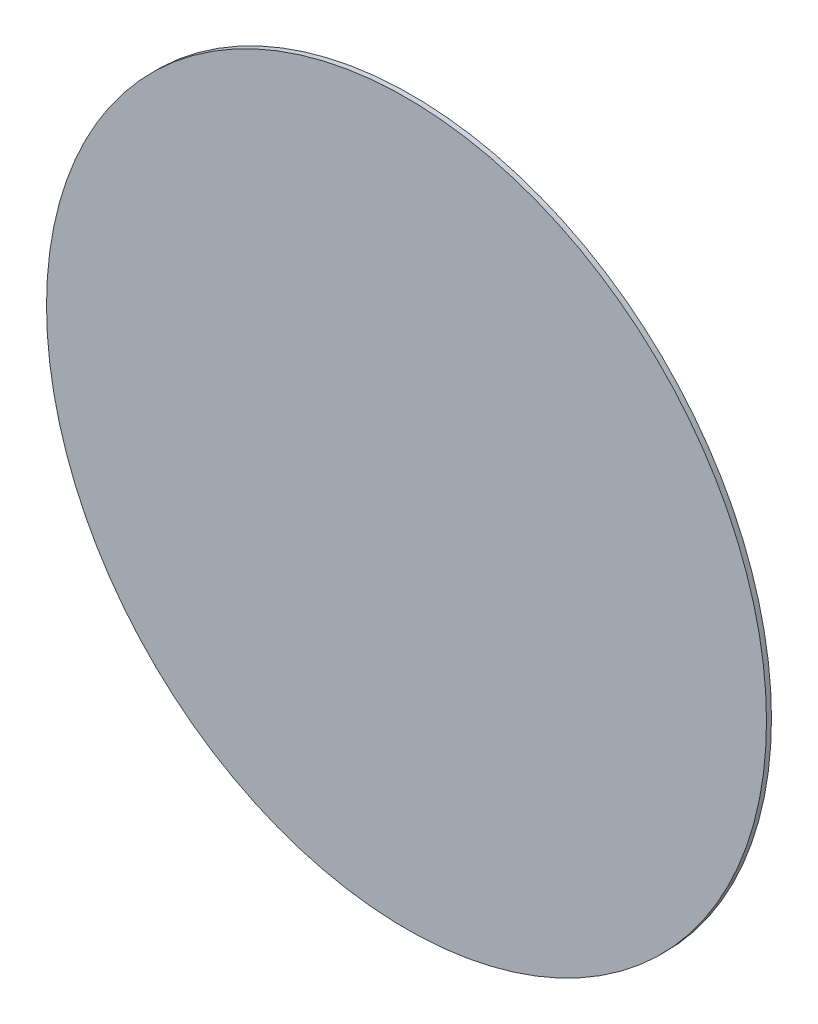
ISO-10303-21;
HEADER;
FILE_DESCRIPTION(('STEP AP214'),'2;1');
FILE_NAME('part.step','',(''),(''),'','','');
FILE_SCHEMA(('AUTOMOTIVE_DESIGN { 1 0 10303 214 1 1 1 1 }'));
ENDSEC;
DATA;
#1=APPLICATION_CONTEXT('core data for automotive mechanical design processes');
#2=APPLICATION_PROTOCOL_DEFINITION('international standard','automotive_design',2000,#1);
#3=PRODUCT_CONTEXT('',#1,'mechanical');
#4=PRODUCT('Part','Part','',(#3));
#5=PRODUCT_RELATED_PRODUCT_CATEGORY('part','',(#4));
#6=PRODUCT_DEFINITION_FORMATION('','',#4);
#7=PRODUCT_DEFINITION_CONTEXT('part definition',#1,'design');
#8=PRODUCT_DEFINITION('design','',#6,#7);
#9=PRODUCT_DEFINITION_SHAPE('','',#8);
#10=(LENGTH_UNIT() NAMED_UNIT(*) SI_UNIT(.MILLI.,.METRE.));
#11=(NAMED_UNIT(*) PLANE_ANGLE_UNIT() SI_UNIT($,.RADIAN.));
#12=(NAMED_UNIT(*) SI_UNIT($,.STERADIAN.) SOLID_ANGLE_UNIT());
#13=UNCERTAINTY_MEASURE_WITH_UNIT(LENGTH_MEASURE(1.E-05),#10,'distance_accuracy_value','');
#14=(GEOMETRIC_REPRESENTATION_CONTEXT(3) GLOBAL_UNCERTAINTY_ASSIGNED_CONTEXT((#13)) GLOBAL_UNIT_ASSIGNED_CONTEXT((#10,
#11,#12)) REPRESENTATION_CONTEXT('',''));
#15=CARTESIAN_POINT('',(0.,0.,0.));
#16=DIRECTION('',(0.,0.,1.));
#17=DIRECTION('',(1.,0.,0.));
#18=AXIS2_PLACEMENT_3D('',#15,#16,#17);
#19=CARTESIAN_POINT('',(0.,0.,3.));
#20=DIRECTION('',(0.,0.,1.));
#21=DIRECTION('',(1.,0.,0.));
#22=AXIS2_PLACEMENT_3D('',#19,#20,#21);
#23=PLANE('',#22);
#24=CARTESIAN_POINT('',(0.,0.,3.));
#25=DIRECTION('',(0.,0.,1.));
#26=DIRECTION('',(1.,0.,0.));
#27=AXIS2_PLACEMENT_3D('',#24,#25,#26);
#28=CIRCLE('',#27,216.5);
#29=CARTESIAN_POINT('',(-216.5,0.,3.));
#30=VERTEX_POINT('',#29);
#31=EDGE_CURVE('E27',#30,#30,#28,.T.);
#32=ORIENTED_EDGE('',*,*,#31,.T.);
#33=EDGE_LOOP('',(#32));
#34=FACE_BOUND('',#33,.T.);
#35=ADVANCED_FACE('F17',(#34),#23,.T.);
#36=CARTESIAN_POINT('',(0.,0.,0.));
#37=DIRECTION('',(0.,0.,1.));
#38=DIRECTION('',(1.,0.,0.));
#39=AXIS2_PLACEMENT_3D('',#36,#37,#38);
#40=CYLINDRICAL_SURFACE('',#39,216.5);
#41=ORIENTED_EDGE('',*,*,#31,.F.);
#42=DIRECTION('',(0.,0.,-1.));
#43=VECTOR('',#42,1.);
#44=CARTESIAN_POINT('',(-216.5,0.,0.));
#45=LINE('',#44,#43);
#46=CARTESIAN_POINT('',(-216.5,0.,0.));
#47=VERTEX_POINT('',#46);
#48=EDGE_CURVE('E11',#30,#47,#45,.T.);
#49=ORIENTED_EDGE('',*,*,#48,.T.);
#50=CARTESIAN_POINT('',(0.,0.,0.));
#51=DIRECTION('',(0.,0.,1.));
#52=DIRECTION('',(1.,0.,0.));
#53=AXIS2_PLACEMENT_3D('',#50,#51,#52);
#54=CIRCLE('',#53,216.5);
#55=EDGE_CURVE('E42',#47,#47,#54,.T.);
#56=ORIENTED_EDGE('',*,*,#55,.T.);
#57=ORIENTED_EDGE('',*,*,#48,.F.);
#58=EDGE_LOOP('',(#41,#49,#56,#57));
#59=FACE_BOUND('',#58,.T.);
#60=ADVANCED_FACE('F40',(#59),#40,.T.);
#61=CARTESIAN_POINT('',(0.,0.,0.));
#62=DIRECTION('',(0.,0.,1.));
#63=DIRECTION('',(1.,0.,0.));
#64=AXIS2_PLACEMENT_3D('',#61,#62,#63);
#65=PLANE('',#64);
#66=ORIENTED_EDGE('',*,*,#55,.F.);
#67=EDGE_LOOP('',(#66));
#68=FACE_BOUND('',#67,.T.);
#69=ADVANCED_FACE('F19',(#68),#65,.F.);
#70=CLOSED_SHELL('',(#35,#60,#69));
#71=MANIFOLD_SOLID_BREP('B1',#70);
#72=ADVANCED_BREP_SHAPE_REPRESENTATION('',(#18,#71),#14);
#73=SHAPE_DEFINITION_REPRESENTATION(#9,#72);
ENDSEC;
END-ISO-10303-21;
